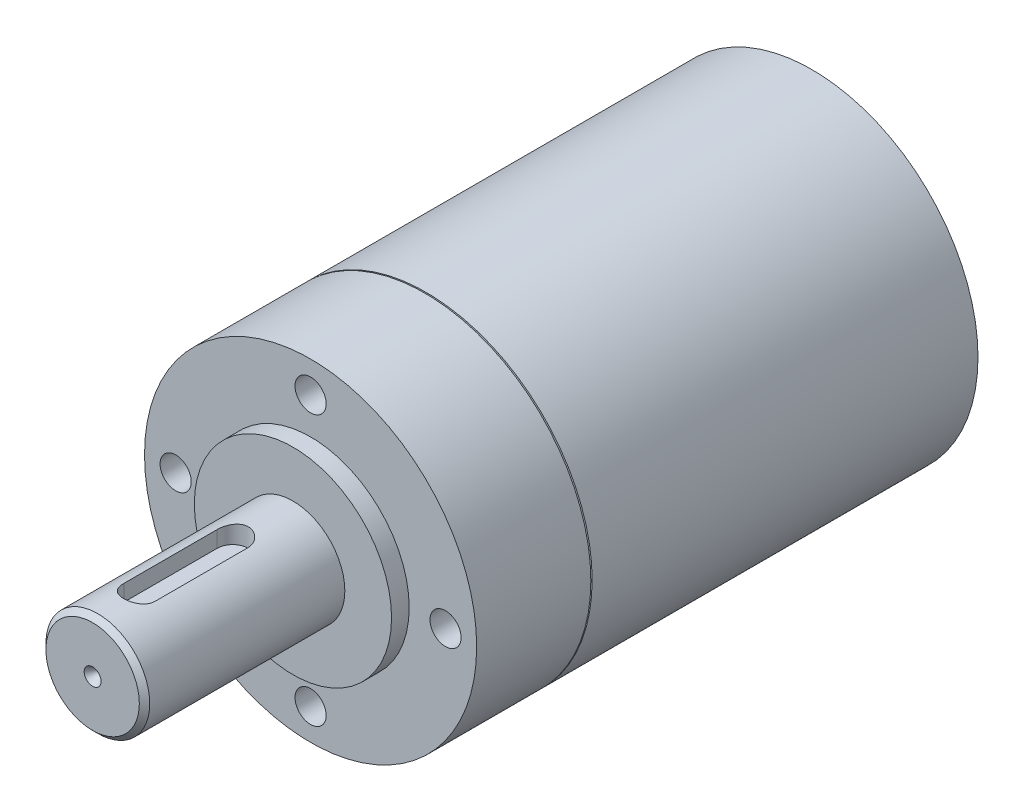
ISO-10303-21;
HEADER;
FILE_DESCRIPTION(('STEP AP214'),'2;1');
FILE_NAME('part.step','',(''),(''),'','','');
FILE_SCHEMA(('AUTOMOTIVE_DESIGN { 1 0 10303 214 1 1 1 1 }'));
ENDSEC;
DATA;
#1=APPLICATION_CONTEXT('core data for automotive mechanical design processes');
#2=APPLICATION_PROTOCOL_DEFINITION('international standard','automotive_design',2000,#1);
#3=PRODUCT_CONTEXT('',#1,'mechanical');
#4=PRODUCT('Part','Part','',(#3));
#5=PRODUCT_RELATED_PRODUCT_CATEGORY('part','',(#4));
#6=PRODUCT_DEFINITION_FORMATION('','',#4);
#7=PRODUCT_DEFINITION_CONTEXT('part definition',#1,'design');
#8=PRODUCT_DEFINITION('design','',#6,#7);
#9=PRODUCT_DEFINITION_SHAPE('','',#8);
#10=(LENGTH_UNIT() NAMED_UNIT(*) SI_UNIT(.MILLI.,.METRE.));
#11=(NAMED_UNIT(*) PLANE_ANGLE_UNIT() SI_UNIT($,.RADIAN.));
#12=(NAMED_UNIT(*) SI_UNIT($,.STERADIAN.) SOLID_ANGLE_UNIT());
#13=UNCERTAINTY_MEASURE_WITH_UNIT(LENGTH_MEASURE(1.E-05),#10,'distance_accuracy_value','');
#14=(GEOMETRIC_REPRESENTATION_CONTEXT(3) GLOBAL_UNCERTAINTY_ASSIGNED_CONTEXT((#13)) GLOBAL_UNIT_ASSIGNED_CONTEXT((#10,
#11,#12)) REPRESENTATION_CONTEXT('',''));
#15=CARTESIAN_POINT('',(0.,0.,0.));
#16=DIRECTION('',(0.,0.,1.));
#17=DIRECTION('',(1.,0.,0.));
#18=AXIS2_PLACEMENT_3D('',#15,#16,#17);
#19=CARTESIAN_POINT('',(0.,0.,69.3));
#20=DIRECTION('',(0.,0.,-1.));
#21=DIRECTION('',(-1.,0.,0.));
#22=AXIS2_PLACEMENT_3D('',#19,#20,#21);
#23=CYLINDRICAL_SURFACE('',#22,5.);
#24=CARTESIAN_POINT('',(0.,0.,68.8));
#25=DIRECTION('',(0.,0.,1.));
#26=DIRECTION('',(1.,0.,0.));
#27=AXIS2_PLACEMENT_3D('',#24,#25,#26);
#28=CIRCLE('',#27,5.);
#29=CARTESIAN_POINT('',(5.,0.,68.8));
#30=VERTEX_POINT('',#29);
#31=EDGE_CURVE('E11',#30,#30,#28,.F.);
#32=ORIENTED_EDGE('',*,*,#31,.T.);
#33=EDGE_LOOP('',(#32));
#34=FACE_BOUND('',#33,.T.);
#35=CARTESIAN_POINT('',(0.,0.,50.));
#36=DIRECTION('',(0.,0.,1.));
#37=DIRECTION('',(1.,0.,0.));
#38=AXIS2_PLACEMENT_3D('',#35,#36,#37);
#39=CIRCLE('',#38,5.);
#40=CARTESIAN_POINT('',(5.,0.,50.));
#41=VERTEX_POINT('',#40);
#42=EDGE_CURVE('E115',#41,#41,#39,.T.);
#43=ORIENTED_EDGE('',*,*,#42,.T.);
#44=EDGE_LOOP('',(#43));
#45=FACE_BOUND('',#44,.T.);
#46=CARTESIAN_POINT('',(-1.5,4.76969600708473,64.8));
#47=CARTESIAN_POINT('',(-1.50000085357071,4.76969249084934,64.841179392908));
#48=CARTESIAN_POINT('',(-1.49830317083428,4.77022997000129,64.8823380431261));
#49=CARTESIAN_POINT('',(-1.49153785660317,4.77235095109999,64.9643411620956));
#50=CARTESIAN_POINT('',(-1.48647098275841,4.77393421787376,65.0051856993949));
#51=CARTESIAN_POINT('',(-1.46630203689311,4.78018490618873,65.1265905409546));
#52=CARTESIAN_POINT('',(-1.44623120413663,4.78635370384275,65.2063063904164));
#53=CARTESIAN_POINT('',(-1.39353102315626,4.80195952113208,65.3610355783859));
#54=CARTESIAN_POINT('',(-1.36090607068203,4.81139539670393,65.4360505521981));
#55=CARTESIAN_POINT('',(-1.28407841117655,4.83246571212052,65.5795966815976));
#56=CARTESIAN_POINT('',(-1.23987031651226,4.84410117434933,65.6481247997284));
#57=CARTESIAN_POINT('',(-1.13964850658326,4.86866835244721,65.778866055997));
#58=CARTESIAN_POINT('',(-1.08333433465209,4.88162755412974,65.8408436603434));
#59=CARTESIAN_POINT('',(-0.961138919873356,4.90714811559049,65.9546355839));
#60=CARTESIAN_POINT('',(-0.895256063916351,4.91970940785249,66.0064481860031));
#61=CARTESIAN_POINT('',(-0.754109921315431,4.94333239727705,66.0994637703185));
#62=CARTESIAN_POINT('',(-0.678680819336257,4.95435770971354,66.1404251802979));
#63=CARTESIAN_POINT('',(-0.521621185505771,4.97334469846208,66.2089884116182));
#64=CARTESIAN_POINT('',(-0.439992259012928,4.98130716463903,66.2365936777943));
#65=CARTESIAN_POINT('',(-0.275324697874882,4.99307639935002,66.276879799102));
#66=CARTESIAN_POINT('',(-0.192393125294257,4.99699549276993,66.2899648579697));
#67=CARTESIAN_POINT('',(-0.025423571998086,5.00063202022426,66.3021173413633));
#68=CARTESIAN_POINT('',(0.058614196242357,5.00035024971471,66.3011874197001));
#69=CARTESIAN_POINT('',(0.222571599946011,4.99569602566267,66.285607091241));
#70=CARTESIAN_POINT('',(0.302537145464636,4.99145415509187,66.2713946550213));
#71=CARTESIAN_POINT('',(0.458890052102021,4.9795151369998,66.2303683647619));
#72=CARTESIAN_POINT('',(0.535277225531992,4.97181780846028,66.2035538505441));
#73=CARTESIAN_POINT('',(0.68334781589221,4.95365214926145,66.1377877783536));
#74=CARTESIAN_POINT('',(0.754966006044136,4.94315255692526,66.0986983556431));
#75=CARTESIAN_POINT('',(0.890765529574414,4.92049624651755,66.0096014099517));
#76=CARTESIAN_POINT('',(0.954945191614588,4.90833915735884,65.9595914405212));
#77=CARTESIAN_POINT('',(1.07665450541274,4.88311673571409,65.8478080119165));
#78=CARTESIAN_POINT('',(1.13383351478033,4.87003445449554,65.7856561362393));
#79=CARTESIAN_POINT('',(1.23706769492487,4.84484215114658,65.6525025765721));
#80=CARTESIAN_POINT('',(1.28311962013078,4.83273241337565,65.5814983196345));
#81=CARTESIAN_POINT('',(1.36316407240863,4.81077228795653,65.4317190715507));
#82=CARTESIAN_POINT('',(1.39703006341134,4.80094596245948,65.3528728204066));
#83=CARTESIAN_POINT('',(1.45085886004699,4.78495663653201,65.1902754960183));
#84=CARTESIAN_POINT('',(1.47084293218035,4.77878803475875,65.1065321392856));
#85=CARTESIAN_POINT('',(1.4890120359008,4.77314032325006,64.9850051109298));
#86=CARTESIAN_POINT('',(1.49313202989009,4.77185156275267,64.9481092658204));
#87=CARTESIAN_POINT('',(1.49862355614854,4.77012928611782,64.8741485209005));
#88=CARTESIAN_POINT('',(1.49999912968269,4.76969451246644,64.8370839503361));
#89=CARTESIAN_POINT('',(1.5,4.76969600708473,64.8));
#90=B_SPLINE_CURVE_WITH_KNOTS('',3,(#46,#47,#48,#49,#50,#51,#52,#53,#54,#55,#56,#57,#58,#59,#60,
#61,#62,#63,#64,#65,#66,#67,#68,#69,#70,#71,#72,#73,#74,#75,#76,#77,#78,#79,#80,#81,#82,#83,#84,
#85,#86,#87,#88,#89),.UNSPECIFIED.,.F.,.F.,(4,2,2,2,2,2,2,2,2,2,2,2,2,2,2,2,2,2,2,2,2,4),(0.,
0.123459071219737,0.246890388853026,0.492911349615204,0.73884624588433,0.984895736828089,
1.23795510798803,1.49105719006936,1.74939356197455,2.00766326783256,2.25854751319801,
2.5093842528947,2.75223130012966,2.99509107067835,3.2407824256273,3.48652887757004,
3.74172568310981,3.99699683536778,4.25484698071526,4.51230123440206,4.62365084745809,
4.73483637253615),.UNSPECIFIED.);
#91=CARTESIAN_POINT('',(-1.5,4.76969600708473,64.8));
#92=VERTEX_POINT('',#91);
#93=CARTESIAN_POINT('',(1.5,4.76969600708473,64.8));
#94=VERTEX_POINT('',#93);
#95=EDGE_CURVE('E82',#92,#94,#90,.T.);
#96=ORIENTED_EDGE('',*,*,#95,.F.);
#97=DIRECTION('',(0.,0.,-1.));
#98=VECTOR('',#97,1.);
#99=CARTESIAN_POINT('',(-1.5,4.76969600708473,69.3));
#100=LINE('',#99,#98);
#101=CARTESIAN_POINT('',(-1.5,4.76969600708473,55.8));
#102=VERTEX_POINT('',#101);
#103=EDGE_CURVE('E128',#102,#92,#100,.F.);
#104=ORIENTED_EDGE('',*,*,#103,.F.);
#105=CARTESIAN_POINT('',(1.5,4.76969600708473,55.8));
#106=CARTESIAN_POINT('',(1.50000085357071,4.76969249084934,55.758820607092));
#107=CARTESIAN_POINT('',(1.49830317083428,4.77022997000129,55.7176619568739));
#108=CARTESIAN_POINT('',(1.49153785660317,4.77235095109999,55.6356588379044));
#109=CARTESIAN_POINT('',(1.48647098275841,4.77393421787376,55.5948143006051));
#110=CARTESIAN_POINT('',(1.46630203689311,4.78018490618873,55.4734094590453));
#111=CARTESIAN_POINT('',(1.44623120413662,4.78635370384275,55.3936936095836));
#112=CARTESIAN_POINT('',(1.39353102315626,4.80195952113208,55.2389644216141));
#113=CARTESIAN_POINT('',(1.36090607068203,4.81139539670393,55.1639494478019));
#114=CARTESIAN_POINT('',(1.28407841117656,4.83246571212052,55.0204033184024));
#115=CARTESIAN_POINT('',(1.23987031651226,4.84410117434933,54.9518752002716));
#116=CARTESIAN_POINT('',(1.13964850658326,4.86866835244721,54.8211339440029));
#117=CARTESIAN_POINT('',(1.08333433465209,4.88162755412974,54.7591563396566));
#118=CARTESIAN_POINT('',(0.961138919873355,4.90714811559049,54.6453644161));
#119=CARTESIAN_POINT('',(0.895256063916348,4.91970940785249,54.5935518139969));
#120=CARTESIAN_POINT('',(0.754109921315429,4.94333239727705,54.5005362296815));
#121=CARTESIAN_POINT('',(0.678680819336258,4.95435770971354,54.459574819702));
#122=CARTESIAN_POINT('',(0.521621185505774,4.97334469846208,54.3910115883818));
#123=CARTESIAN_POINT('',(0.439992259012927,4.98130716463903,54.3634063222057));
#124=CARTESIAN_POINT('',(0.275324697874878,4.99307639935002,54.3231202008979));
#125=CARTESIAN_POINT('',(0.192393125294252,4.99699549276993,54.3100351420303));
#126=CARTESIAN_POINT('',(0.0254235719980798,5.00063202022426,54.2978826586367));
#127=CARTESIAN_POINT('',(-0.0586141962423645,5.00035024971471,54.2988125802998));
#128=CARTESIAN_POINT('',(-0.222571599946019,4.99569602566267,54.314392908759));
#129=CARTESIAN_POINT('',(-0.302537145464644,4.99145415509187,54.3286053449787));
#130=CARTESIAN_POINT('',(-0.458890052102028,4.9795151369998,54.3696316352381));
#131=CARTESIAN_POINT('',(-0.535277225531999,4.97181780846028,54.3964461494559));
#132=CARTESIAN_POINT('',(-0.683347815892216,4.95365214926145,54.4622122216464));
#133=CARTESIAN_POINT('',(-0.754966006044142,4.94315255692525,54.5013016443569));
#134=CARTESIAN_POINT('',(-0.89076552957442,4.92049624651755,54.5903985900483));
#135=CARTESIAN_POINT('',(-0.954945191614595,4.90833915735884,54.6404085594788));
#136=CARTESIAN_POINT('',(-1.07665450541275,4.88311673571409,54.7521919880835));
#137=CARTESIAN_POINT('',(-1.13383351478034,4.87003445449554,54.8143438637607));
#138=CARTESIAN_POINT('',(-1.23706769492487,4.84484215114658,54.9474974234279));
#139=CARTESIAN_POINT('',(-1.28311962013078,4.83273241337565,55.0185016803655));
#140=CARTESIAN_POINT('',(-1.36316407240864,4.81077228795653,55.1682809284493));
#141=CARTESIAN_POINT('',(-1.39703006341135,4.80094596245948,55.2471271795934));
#142=CARTESIAN_POINT('',(-1.45085886004699,4.78495663653201,55.4097245039817));
#143=CARTESIAN_POINT('',(-1.47084293218036,4.77878803475875,55.4934678607144));
#144=CARTESIAN_POINT('',(-1.4890120359008,4.77314032325006,55.6149948890702));
#145=CARTESIAN_POINT('',(-1.49313202989009,4.77185156275267,55.6518907341796));
#146=CARTESIAN_POINT('',(-1.49862355614854,4.77012928611782,55.7258514790995));
#147=CARTESIAN_POINT('',(-1.49999912968269,4.76969451246644,55.7629160496639));
#148=CARTESIAN_POINT('',(-1.5,4.76969600708473,55.8));
#149=B_SPLINE_CURVE_WITH_KNOTS('',3,(#105,#106,#107,#108,#109,#110,#111,#112,#113,#114,#115,
#116,#117,#118,#119,#120,#121,#122,#123,#124,#125,#126,#127,#128,#129,#130,#131,#132,#133,#134,
#135,#136,#137,#138,#139,#140,#141,#142,#143,#144,#145,#146,#147,#148),.UNSPECIFIED.,.F.,.F.,(4,
2,2,2,2,2,2,2,2,2,2,2,2,2,2,2,2,2,2,2,2,4),(0.,0.123459071219744,0.246890388853054,
0.492911349615212,0.738846245884322,0.984895736828089,1.23795510798802,1.49105719006936,
1.74939356197455,2.00766326783256,2.25854751319802,2.5093842528947,2.75223130012966,
2.99509107067836,3.2407824256273,3.48652887757005,3.74172568310981,3.99699683536778,
4.25484698071528,4.51230123440207,4.62365084745808,4.73483637253615),.UNSPECIFIED.);
#150=CARTESIAN_POINT('',(1.5,4.76969600708473,55.8));
#151=VERTEX_POINT('',#150);
#152=EDGE_CURVE('E132',#151,#102,#149,.T.);
#153=ORIENTED_EDGE('',*,*,#152,.F.);
#154=DIRECTION('',(0.,0.,-1.));
#155=VECTOR('',#154,1.);
#156=CARTESIAN_POINT('',(1.5,4.76969600708473,69.3));
#157=LINE('',#156,#155);
#158=EDGE_CURVE('E139',#94,#151,#157,.T.);
#159=ORIENTED_EDGE('',*,*,#158,.F.);
#160=EDGE_LOOP('',(#96,#104,#153,#159));
#161=FACE_BOUND('',#160,.T.);
#162=ADVANCED_FACE('F34',(#34,#45,#161),#23,.T.);
#163=CARTESIAN_POINT('',(0.,0.,50.));
#164=DIRECTION('',(0.,0.,1.));
#165=DIRECTION('',(1.,0.,0.));
#166=AXIS2_PLACEMENT_3D('',#163,#164,#165);
#167=PLANE('',#166);
#168=CARTESIAN_POINT('',(0.,0.,50.));
#169=DIRECTION('',(0.,0.,1.));
#170=DIRECTION('',(1.,0.,0.));
#171=AXIS2_PLACEMENT_3D('',#168,#169,#170);
#172=CIRCLE('',#171,9.5);
#173=CARTESIAN_POINT('',(9.5,0.,50.));
#174=VERTEX_POINT('',#173);
#175=EDGE_CURVE('E119',#174,#174,#172,.T.);
#176=ORIENTED_EDGE('',*,*,#175,.T.);
#177=EDGE_LOOP('',(#176));
#178=FACE_BOUND('',#177,.T.);
#179=ORIENTED_EDGE('',*,*,#42,.F.);
#180=EDGE_LOOP('',(#179));
#181=FACE_BOUND('',#180,.T.);
#182=ADVANCED_FACE('F191',(#178,#181),#167,.T.);
#183=CARTESIAN_POINT('',(0.,0.,48.3));
#184=DIRECTION('',(0.,0.,1.));
#185=DIRECTION('',(1.,0.,0.));
#186=AXIS2_PLACEMENT_3D('',#183,#184,#185);
#187=PLANE('',#186);
#188=CARTESIAN_POINT('',(13.,0.,48.3));
#189=DIRECTION('',(0.,0.,1.));
#190=DIRECTION('',(1.,0.,0.));
#191=AXIS2_PLACEMENT_3D('',#188,#189,#190);
#192=CIRCLE('',#191,1.5);
#193=CARTESIAN_POINT('',(14.5,0.,48.3));
#194=VERTEX_POINT('',#193);
#195=EDGE_CURVE('E356',#194,#194,#192,.T.);
#196=ORIENTED_EDGE('',*,*,#195,.F.);
#197=EDGE_LOOP('',(#196));
#198=FACE_BOUND('',#197,.T.);
#199=CARTESIAN_POINT('',(0.,-13.,48.3));
#200=DIRECTION('',(0.,0.,1.));
#201=DIRECTION('',(1.,0.,0.));
#202=AXIS2_PLACEMENT_3D('',#199,#200,#201);
#203=CIRCLE('',#202,1.5);
#204=CARTESIAN_POINT('',(1.5,-13.,48.3));
#205=VERTEX_POINT('',#204);
#206=EDGE_CURVE('E363',#205,#205,#203,.T.);
#207=ORIENTED_EDGE('',*,*,#206,.F.);
#208=EDGE_LOOP('',(#207));
#209=FACE_BOUND('',#208,.T.);
#210=CARTESIAN_POINT('',(-13.,0.,48.3));
#211=DIRECTION('',(0.,0.,1.));
#212=DIRECTION('',(1.,0.,0.));
#213=AXIS2_PLACEMENT_3D('',#210,#211,#212);
#214=CIRCLE('',#213,1.5);
#215=CARTESIAN_POINT('',(-11.5,0.,48.3));
#216=VERTEX_POINT('',#215);
#217=EDGE_CURVE('E369',#216,#216,#214,.T.);
#218=ORIENTED_EDGE('',*,*,#217,.F.);
#219=EDGE_LOOP('',(#218));
#220=FACE_BOUND('',#219,.T.);
#221=CARTESIAN_POINT('',(0.,13.,48.3));
#222=DIRECTION('',(0.,0.,1.));
#223=DIRECTION('',(1.,0.,0.));
#224=AXIS2_PLACEMENT_3D('',#221,#222,#223);
#225=CIRCLE('',#224,1.5);
#226=CARTESIAN_POINT('',(1.5,13.,48.3));
#227=VERTEX_POINT('',#226);
#228=EDGE_CURVE('E103',#227,#227,#225,.T.);
#229=ORIENTED_EDGE('',*,*,#228,.F.);
#230=EDGE_LOOP('',(#229));
#231=FACE_BOUND('',#230,.T.);
#232=CARTESIAN_POINT('',(0.,0.,48.3));
#233=DIRECTION('',(0.,0.,1.));
#234=DIRECTION('',(1.,0.,0.));
#235=AXIS2_PLACEMENT_3D('',#232,#233,#234);
#236=CIRCLE('',#235,16.);
#237=CARTESIAN_POINT('',(-16.,0.,48.3));
#238=VERTEX_POINT('',#237);
#239=EDGE_CURVE('E125',#238,#238,#236,.T.);
#240=ORIENTED_EDGE('',*,*,#239,.T.);
#241=EDGE_LOOP('',(#240));
#242=FACE_BOUND('',#241,.T.);
#243=CARTESIAN_POINT('',(0.,0.,48.3));
#244=DIRECTION('',(0.,0.,1.));
#245=DIRECTION('',(1.,0.,0.));
#246=AXIS2_PLACEMENT_3D('',#243,#244,#245);
#247=CIRCLE('',#246,9.5);
#248=CARTESIAN_POINT('',(9.5,0.,48.3));
#249=VERTEX_POINT('',#248);
#250=EDGE_CURVE('E118',#249,#249,#247,.T.);
#251=ORIENTED_EDGE('',*,*,#250,.F.);
#252=EDGE_LOOP('',(#251));
#253=FACE_BOUND('',#252,.T.);
#254=ADVANCED_FACE('F196',(#198,#209,#220,#231,#242,#253),#187,.T.);
#255=CARTESIAN_POINT('',(0.,0.,48.3));
#256=DIRECTION('',(0.,0.,-1.));
#257=DIRECTION('',(-1.,0.,0.));
#258=AXIS2_PLACEMENT_3D('',#255,#256,#257);
#259=CYLINDRICAL_SURFACE('',#258,16.);
#260=CARTESIAN_POINT('',(0.,0.,37.3));
#261=DIRECTION('',(0.,0.,1.));
#262=DIRECTION('',(1.,0.,0.));
#263=AXIS2_PLACEMENT_3D('',#260,#261,#262);
#264=CIRCLE('',#263,16.);
#265=CARTESIAN_POINT('',(-16.,0.,37.3));
#266=VERTEX_POINT('',#265);
#267=EDGE_CURVE('E167',#266,#266,#264,.T.);
#268=CARTESIAN_POINT('',(-16.,0.,37.3));
#269=CARTESIAN_POINT('',(-16.,0.,37.4145833333333));
#270=CARTESIAN_POINT('',(-16.,0.,37.5291666666667));
#271=CARTESIAN_POINT('',(-16.,0.,37.7583333333333));
#272=CARTESIAN_POINT('',(-16.,0.,37.8729166666667));
#273=CARTESIAN_POINT('',(-16.,0.,38.1020833333333));
#274=CARTESIAN_POINT('',(-16.,0.,38.2166666666667));
#275=CARTESIAN_POINT('',(-16.,0.,38.4458333333333));
#276=CARTESIAN_POINT('',(-16.,0.,38.5604166666667));
#277=CARTESIAN_POINT('',(-16.,0.,38.7895833333333));
#278=CARTESIAN_POINT('',(-16.,0.,38.9041666666667));
#279=CARTESIAN_POINT('',(-16.,0.,39.1333333333333));
#280=CARTESIAN_POINT('',(-16.,0.,39.2479166666667));
#281=CARTESIAN_POINT('',(-16.,0.,39.4770833333333));
#282=CARTESIAN_POINT('',(-16.,0.,39.5916666666667));
#283=CARTESIAN_POINT('',(-16.,0.,39.8208333333333));
#284=CARTESIAN_POINT('',(-16.,0.,39.9354166666667));
#285=CARTESIAN_POINT('',(-16.,0.,40.1645833333333));
#286=CARTESIAN_POINT('',(-16.,0.,40.2791666666667));
#287=CARTESIAN_POINT('',(-16.,0.,40.5083333333333));
#288=CARTESIAN_POINT('',(-16.,0.,40.6229166666667));
#289=CARTESIAN_POINT('',(-16.,0.,40.8520833333333));
#290=CARTESIAN_POINT('',(-16.,0.,40.9666666666667));
#291=CARTESIAN_POINT('',(-16.,0.,41.1958333333333));
#292=CARTESIAN_POINT('',(-16.,0.,41.3104166666667));
#293=CARTESIAN_POINT('',(-16.,0.,41.5395833333333));
#294=CARTESIAN_POINT('',(-16.,0.,41.6541666666667));
#295=CARTESIAN_POINT('',(-16.,0.,41.8833333333333));
#296=CARTESIAN_POINT('',(-16.,0.,41.9979166666667));
#297=CARTESIAN_POINT('',(-16.,0.,42.2270833333333));
#298=CARTESIAN_POINT('',(-16.,0.,42.3416666666667));
#299=CARTESIAN_POINT('',(-16.,0.,42.5708333333333));
#300=CARTESIAN_POINT('',(-16.,0.,42.6854166666667));
#301=CARTESIAN_POINT('',(-16.,0.,42.9145833333333));
#302=CARTESIAN_POINT('',(-16.,0.,43.0291666666667));
#303=CARTESIAN_POINT('',(-16.,0.,43.2583333333333));
#304=CARTESIAN_POINT('',(-16.,0.,43.3729166666667));
#305=CARTESIAN_POINT('',(-16.,0.,43.6020833333333));
#306=CARTESIAN_POINT('',(-16.,0.,43.7166666666667));
#307=CARTESIAN_POINT('',(-16.,0.,43.9458333333333));
#308=CARTESIAN_POINT('',(-16.,0.,44.0604166666667));
#309=CARTESIAN_POINT('',(-16.,0.,44.2895833333333));
#310=CARTESIAN_POINT('',(-16.,0.,44.4041666666667));
#311=CARTESIAN_POINT('',(-16.,0.,44.6333333333333));
#312=CARTESIAN_POINT('',(-16.,0.,44.7479166666667));
#313=CARTESIAN_POINT('',(-16.,0.,44.9770833333333));
#314=CARTESIAN_POINT('',(-16.,0.,45.0916666666667));
#315=CARTESIAN_POINT('',(-16.,0.,45.3208333333333));
#316=CARTESIAN_POINT('',(-16.,0.,45.4354166666667));
#317=CARTESIAN_POINT('',(-16.,0.,45.6645833333333));
#318=CARTESIAN_POINT('',(-16.,0.,45.7791666666667));
#319=CARTESIAN_POINT('',(-16.,0.,46.0083333333333));
#320=CARTESIAN_POINT('',(-16.,0.,46.1229166666667));
#321=CARTESIAN_POINT('',(-16.,0.,46.3520833333333));
#322=CARTESIAN_POINT('',(-16.,0.,46.4666666666667));
#323=CARTESIAN_POINT('',(-16.,0.,46.6958333333333));
#324=CARTESIAN_POINT('',(-16.,0.,46.8104166666667));
#325=CARTESIAN_POINT('',(-16.,0.,47.0395833333333));
#326=CARTESIAN_POINT('',(-16.,0.,47.1541666666667));
#327=CARTESIAN_POINT('',(-16.,0.,47.3833333333333));
#328=CARTESIAN_POINT('',(-16.,0.,47.4979166666667));
#329=CARTESIAN_POINT('',(-16.,0.,47.7270833333333));
#330=CARTESIAN_POINT('',(-16.,0.,47.8416666666667));
#331=CARTESIAN_POINT('',(-16.,0.,48.0708333333333));
#332=CARTESIAN_POINT('',(-16.,0.,48.1854166666667));
#333=CARTESIAN_POINT('',(-16.,0.,48.3));
#334=B_SPLINE_CURVE_WITH_KNOTS('',3,(#268,#269,#270,#271,#272,#273,#274,#275,#276,#277,#278,
#279,#280,#281,#282,#283,#284,#285,#286,#287,#288,#289,#290,#291,#292,#293,#294,#295,#296,#297,
#298,#299,#300,#301,#302,#303,#304,#305,#306,#307,#308,#309,#310,#311,#312,#313,#314,#315,#316,
#317,#318,#319,#320,#321,#322,#323,#324,#325,#326,#327,#328,#329,#330,#331,#332,#333),
.UNSPECIFIED.,.F.,.F.,(4,2,2,2,2,2,2,2,2,2,2,2,2,2,2,2,2,2,2,2,2,2,2,2,2,2,2,2,2,2,2,2,4),(0.,
0.343750000000004,0.687500000000001,1.03125,1.375,1.71875,2.0625,2.40625000000001,2.75,3.09375,
3.4375,3.78125,4.125,4.46875,4.8125,5.15625,5.5,5.84375,6.1875,6.53125,6.875,7.21875,7.5625,
7.90625,8.25,8.59375,8.9375,9.28125,9.625,9.96875,10.3125,10.65625,11.),.UNSPECIFIED.);
#335=EDGE_CURVE('BSEAM188',#266,#238,#334,.T.);
#336=ORIENTED_EDGE('',*,*,#267,.T.);
#337=ORIENTED_EDGE('',*,*,#239,.F.);
#338=ORIENTED_EDGE('',*,*,#335,.T.);
#339=ORIENTED_EDGE('',*,*,#335,.F.);
#340=EDGE_LOOP('',(#336,#338,#337,#339));
#341=FACE_BOUND('',#340,.T.);
#342=ADVANCED_FACE('F188',(#341),#259,.T.);
#343=CARTESIAN_POINT('',(0.,0.,50.));
#344=DIRECTION('',(0.,0.,-1.));
#345=DIRECTION('',(-1.,0.,0.));
#346=AXIS2_PLACEMENT_3D('',#343,#344,#345);
#347=CYLINDRICAL_SURFACE('',#346,9.5);
#348=ORIENTED_EDGE('',*,*,#175,.F.);
#349=EDGE_LOOP('',(#348));
#350=FACE_BOUND('',#349,.T.);
#351=ORIENTED_EDGE('',*,*,#250,.T.);
#352=EDGE_LOOP('',(#351));
#353=FACE_BOUND('',#352,.T.);
#354=ADVANCED_FACE('F311',(#350,#353),#347,.T.);
#355=CARTESIAN_POINT('',(0.,0.,69.3));
#356=DIRECTION('',(0.,0.,1.));
#357=DIRECTION('',(1.,0.,0.));
#358=AXIS2_PLACEMENT_3D('',#355,#356,#357);
#359=PLANE('',#358);
#360=CARTESIAN_POINT('',(0.,0.,69.3));
#361=DIRECTION('',(0.,0.,1.));
#362=DIRECTION('',(1.,0.,0.));
#363=AXIS2_PLACEMENT_3D('',#360,#361,#362);
#364=CIRCLE('',#363,4.50000000000002);
#365=CARTESIAN_POINT('',(4.50000000000002,0.,69.3));
#366=VERTEX_POINT('',#365);
#367=EDGE_CURVE('E42',#366,#366,#364,.T.);
#368=ORIENTED_EDGE('',*,*,#367,.T.);
#369=EDGE_LOOP('',(#368));
#370=FACE_BOUND('',#369,.T.);
#371=CARTESIAN_POINT('',(0.,0.,69.3));
#372=DIRECTION('',(0.,0.,1.));
#373=DIRECTION('',(1.,0.,0.));
#374=AXIS2_PLACEMENT_3D('',#371,#372,#373);
#375=CIRCLE('',#374,0.813334858543817);
#376=CARTESIAN_POINT('',(0.813334858543817,0.,69.3));
#377=VERTEX_POINT('',#376);
#378=EDGE_CURVE('E85',#377,#377,#375,.T.);
#379=ORIENTED_EDGE('',*,*,#378,.F.);
#380=EDGE_LOOP('',(#379));
#381=FACE_BOUND('',#380,.T.);
#382=ADVANCED_FACE('F177',(#370,#381),#359,.T.);
#383=CARTESIAN_POINT('',(0.,0.,69.3));
#384=DIRECTION('',(0.,0.,1.));
#385=DIRECTION('',(1.,0.,0.));
#386=AXIS2_PLACEMENT_3D('',#383,#384,#385);
#387=CONICAL_SURFACE('',#386,0.813334858543817,0.558505360638186);
#388=CARTESIAN_POINT('',(0.,0.,67.9983921421996));
#389=VERTEX_POINT('',#388);
#390=VERTEX_LOOP('',#389);
#391=FACE_BOUND('',#390,.T.);
#392=ORIENTED_EDGE('',*,*,#378,.T.);
#393=EDGE_LOOP('',(#392));
#394=FACE_BOUND('',#393,.T.);
#395=ADVANCED_FACE('F157',(#391,#394),#387,.F.);
#396=CARTESIAN_POINT('',(0.,6.2,64.8));
#397=DIRECTION('',(0.,-1.,0.));
#398=DIRECTION('',(0.,0.,-1.));
#399=AXIS2_PLACEMENT_3D('',#396,#397,#398);
#400=CYLINDRICAL_SURFACE('',#399,1.5);
#401=ORIENTED_EDGE('',*,*,#95,.T.);
#402=DIRECTION('',(0.,-1.,0.));
#403=VECTOR('',#402,1.);
#404=CARTESIAN_POINT('',(1.5,6.2,64.8));
#405=LINE('',#404,#403);
#406=CARTESIAN_POINT('',(1.5,3.2,64.8));
#407=VERTEX_POINT('',#406);
#408=EDGE_CURVE('E75',#94,#407,#405,.T.);
#409=ORIENTED_EDGE('',*,*,#408,.T.);
#410=CARTESIAN_POINT('',(0.,3.2,64.8));
#411=DIRECTION('',(0.,1.,0.));
#412=DIRECTION('',(0.,0.,1.));
#413=AXIS2_PLACEMENT_3D('',#410,#411,#412);
#414=CIRCLE('',#413,1.5);
#415=CARTESIAN_POINT('',(-1.5,3.2,64.8));
#416=VERTEX_POINT('',#415);
#417=EDGE_CURVE('E80',#416,#407,#414,.T.);
#418=ORIENTED_EDGE('',*,*,#417,.F.);
#419=DIRECTION('',(0.,-1.,0.));
#420=VECTOR('',#419,1.);
#421=CARTESIAN_POINT('',(-1.5,6.2,64.8));
#422=LINE('',#421,#420);
#423=EDGE_CURVE('E109',#92,#416,#422,.T.);
#424=ORIENTED_EDGE('',*,*,#423,.F.);
#425=EDGE_LOOP('',(#401,#409,#418,#424));
#426=FACE_BOUND('',#425,.T.);
#427=ADVANCED_FACE('F77',(#426),#400,.F.);
#428=CARTESIAN_POINT('',(1.5,6.2,64.8));
#429=DIRECTION('',(-1.,0.,0.));
#430=DIRECTION('',(0.,0.,1.));
#431=AXIS2_PLACEMENT_3D('',#428,#429,#430);
#432=PLANE('',#431);
#433=ORIENTED_EDGE('',*,*,#158,.T.);
#434=DIRECTION('',(0.,-1.,0.));
#435=VECTOR('',#434,1.);
#436=CARTESIAN_POINT('',(1.5,6.2,55.8));
#437=LINE('',#436,#435);
#438=CARTESIAN_POINT('',(1.5,3.2,55.8));
#439=VERTEX_POINT('',#438);
#440=EDGE_CURVE('E86',#151,#439,#437,.T.);
#441=ORIENTED_EDGE('',*,*,#440,.T.);
#442=DIRECTION('',(0.,0.,-1.));
#443=VECTOR('',#442,1.);
#444=CARTESIAN_POINT('',(1.5,3.2,64.8));
#445=LINE('',#444,#443);
#446=EDGE_CURVE('E89',#407,#439,#445,.T.);
#447=ORIENTED_EDGE('',*,*,#446,.F.);
#448=ORIENTED_EDGE('',*,*,#408,.F.);
#449=EDGE_LOOP('',(#433,#441,#447,#448));
#450=FACE_BOUND('',#449,.T.);
#451=ADVANCED_FACE('F90',(#450),#432,.T.);
#452=CARTESIAN_POINT('',(0.,6.2,55.8));
#453=DIRECTION('',(0.,-1.,0.));
#454=DIRECTION('',(0.,0.,-1.));
#455=AXIS2_PLACEMENT_3D('',#452,#453,#454);
#456=CYLINDRICAL_SURFACE('',#455,1.5);
#457=ORIENTED_EDGE('',*,*,#152,.T.);
#458=DIRECTION('',(0.,-1.,0.));
#459=VECTOR('',#458,1.);
#460=CARTESIAN_POINT('',(-1.5,6.2,55.8));
#461=LINE('',#460,#459);
#462=CARTESIAN_POINT('',(-1.5,3.2,55.8));
#463=VERTEX_POINT('',#462);
#464=EDGE_CURVE('E49',#102,#463,#461,.T.);
#465=ORIENTED_EDGE('',*,*,#464,.T.);
#466=CARTESIAN_POINT('',(0.,3.2,55.8));
#467=DIRECTION('',(0.,1.,0.));
#468=DIRECTION('',(0.,0.,1.));
#469=AXIS2_PLACEMENT_3D('',#466,#467,#468);
#470=CIRCLE('',#469,1.5);
#471=EDGE_CURVE('E95',#439,#463,#470,.T.);
#472=ORIENTED_EDGE('',*,*,#471,.F.);
#473=ORIENTED_EDGE('',*,*,#440,.F.);
#474=EDGE_LOOP('',(#457,#465,#472,#473));
#475=FACE_BOUND('',#474,.T.);
#476=ADVANCED_FACE('F144',(#475),#456,.F.);
#477=CARTESIAN_POINT('',(-1.5,6.2,64.8));
#478=DIRECTION('',(1.,0.,0.));
#479=DIRECTION('',(0.,0.,-1.));
#480=AXIS2_PLACEMENT_3D('',#477,#478,#479);
#481=PLANE('',#480);
#482=ORIENTED_EDGE('',*,*,#103,.T.);
#483=ORIENTED_EDGE('',*,*,#423,.T.);
#484=DIRECTION('',(0.,0.,1.));
#485=VECTOR('',#484,1.);
#486=CARTESIAN_POINT('',(-1.5,3.2,64.8));
#487=LINE('',#486,#485);
#488=EDGE_CURVE('E99',#463,#416,#487,.T.);
#489=ORIENTED_EDGE('',*,*,#488,.F.);
#490=ORIENTED_EDGE('',*,*,#464,.F.);
#491=EDGE_LOOP('',(#482,#483,#489,#490));
#492=FACE_BOUND('',#491,.T.);
#493=ADVANCED_FACE('F149',(#492),#481,.T.);
#494=CARTESIAN_POINT('',(0.,3.2,64.8));
#495=DIRECTION('',(0.,1.,0.));
#496=DIRECTION('',(0.,0.,1.));
#497=AXIS2_PLACEMENT_3D('',#494,#495,#496);
#498=PLANE('',#497);
#499=ORIENTED_EDGE('',*,*,#417,.T.);
#500=ORIENTED_EDGE('',*,*,#446,.T.);
#501=ORIENTED_EDGE('',*,*,#471,.T.);
#502=ORIENTED_EDGE('',*,*,#488,.T.);
#503=EDGE_LOOP('',(#499,#500,#501,#502));
#504=FACE_BOUND('',#503,.T.);
#505=ADVANCED_FACE('F98',(#504),#498,.T.);
#506=CARTESIAN_POINT('',(0.,13.,42.3));
#507=DIRECTION('',(0.,0.,1.));
#508=DIRECTION('',(1.,0.,0.));
#509=AXIS2_PLACEMENT_3D('',#506,#507,#508);
#510=CYLINDRICAL_SURFACE('',#509,1.5);
#511=CARTESIAN_POINT('',(0.,13.,42.3));
#512=DIRECTION('',(0.,0.,1.));
#513=DIRECTION('',(1.,0.,0.));
#514=AXIS2_PLACEMENT_3D('',#511,#512,#513);
#515=CIRCLE('',#514,1.5);
#516=CARTESIAN_POINT('',(1.5,13.,42.3));
#517=VERTEX_POINT('',#516);
#518=EDGE_CURVE('E100',#517,#517,#515,.T.);
#519=ORIENTED_EDGE('',*,*,#518,.F.);
#520=EDGE_LOOP('',(#519));
#521=FACE_BOUND('',#520,.T.);
#522=ORIENTED_EDGE('',*,*,#228,.T.);
#523=EDGE_LOOP('',(#522));
#524=FACE_BOUND('',#523,.T.);
#525=ADVANCED_FACE('F207',(#521,#524),#510,.F.);
#526=CARTESIAN_POINT('',(0.,13.,42.3));
#527=DIRECTION('',(0.,0.,1.));
#528=DIRECTION('',(1.,0.,0.));
#529=AXIS2_PLACEMENT_3D('',#526,#527,#528);
#530=PLANE('',#529);
#531=ORIENTED_EDGE('',*,*,#518,.T.);
#532=EDGE_LOOP('',(#531));
#533=FACE_BOUND('',#532,.T.);
#534=ADVANCED_FACE('F211',(#533),#530,.T.);
#535=CARTESIAN_POINT('',(-13.,0.,42.3));
#536=DIRECTION('',(0.,0.,1.));
#537=DIRECTION('',(1.,0.,0.));
#538=AXIS2_PLACEMENT_3D('',#535,#536,#537);
#539=CYLINDRICAL_SURFACE('',#538,1.5);
#540=CARTESIAN_POINT('',(-13.,0.,42.3));
#541=DIRECTION('',(0.,0.,1.));
#542=DIRECTION('',(1.,0.,0.));
#543=AXIS2_PLACEMENT_3D('',#540,#541,#542);
#544=CIRCLE('',#543,1.5);
#545=CARTESIAN_POINT('',(-11.5,0.,42.3));
#546=VERTEX_POINT('',#545);
#547=EDGE_CURVE('E372',#546,#546,#544,.T.);
#548=ORIENTED_EDGE('',*,*,#547,.F.);
#549=EDGE_LOOP('',(#548));
#550=FACE_BOUND('',#549,.T.);
#551=ORIENTED_EDGE('',*,*,#217,.T.);
#552=EDGE_LOOP('',(#551));
#553=FACE_BOUND('',#552,.T.);
#554=ADVANCED_FACE('F217',(#550,#553),#539,.F.);
#555=CARTESIAN_POINT('',(-13.,0.,42.3));
#556=DIRECTION('',(0.,0.,1.));
#557=DIRECTION('',(1.,0.,0.));
#558=AXIS2_PLACEMENT_3D('',#555,#556,#557);
#559=PLANE('',#558);
#560=ORIENTED_EDGE('',*,*,#547,.T.);
#561=EDGE_LOOP('',(#560));
#562=FACE_BOUND('',#561,.T.);
#563=ADVANCED_FACE('F221',(#562),#559,.T.);
#564=CARTESIAN_POINT('',(0.,-13.,42.3));
#565=DIRECTION('',(0.,0.,1.));
#566=DIRECTION('',(1.,0.,0.));
#567=AXIS2_PLACEMENT_3D('',#564,#565,#566);
#568=CYLINDRICAL_SURFACE('',#567,1.5);
#569=CARTESIAN_POINT('',(0.,-13.,42.3));
#570=DIRECTION('',(0.,0.,1.));
#571=DIRECTION('',(1.,0.,0.));
#572=AXIS2_PLACEMENT_3D('',#569,#570,#571);
#573=CIRCLE('',#572,1.5);
#574=CARTESIAN_POINT('',(1.5,-13.,42.3));
#575=VERTEX_POINT('',#574);
#576=EDGE_CURVE('E366',#575,#575,#573,.T.);
#577=ORIENTED_EDGE('',*,*,#576,.F.);
#578=EDGE_LOOP('',(#577));
#579=FACE_BOUND('',#578,.T.);
#580=ORIENTED_EDGE('',*,*,#206,.T.);
#581=EDGE_LOOP('',(#580));
#582=FACE_BOUND('',#581,.T.);
#583=ADVANCED_FACE('F225',(#579,#582),#568,.F.);
#584=CARTESIAN_POINT('',(0.,-13.,42.3));
#585=DIRECTION('',(0.,0.,1.));
#586=DIRECTION('',(1.,0.,0.));
#587=AXIS2_PLACEMENT_3D('',#584,#585,#586);
#588=PLANE('',#587);
#589=ORIENTED_EDGE('',*,*,#576,.T.);
#590=EDGE_LOOP('',(#589));
#591=FACE_BOUND('',#590,.T.);
#592=ADVANCED_FACE('F229',(#591),#588,.T.);
#593=CARTESIAN_POINT('',(13.,0.,42.3));
#594=DIRECTION('',(0.,0.,1.));
#595=DIRECTION('',(1.,0.,0.));
#596=AXIS2_PLACEMENT_3D('',#593,#594,#595);
#597=CYLINDRICAL_SURFACE('',#596,1.5);
#598=CARTESIAN_POINT('',(13.,0.,42.3));
#599=DIRECTION('',(0.,0.,1.));
#600=DIRECTION('',(1.,0.,0.));
#601=AXIS2_PLACEMENT_3D('',#598,#599,#600);
#602=CIRCLE('',#601,1.5);
#603=CARTESIAN_POINT('',(14.5,0.,42.3));
#604=VERTEX_POINT('',#603);
#605=EDGE_CURVE('E360',#604,#604,#602,.T.);
#606=ORIENTED_EDGE('',*,*,#605,.F.);
#607=EDGE_LOOP('',(#606));
#608=FACE_BOUND('',#607,.T.);
#609=ORIENTED_EDGE('',*,*,#195,.T.);
#610=EDGE_LOOP('',(#609));
#611=FACE_BOUND('',#610,.T.);
#612=ADVANCED_FACE('F233',(#608,#611),#597,.F.);
#613=CARTESIAN_POINT('',(13.,0.,42.3));
#614=DIRECTION('',(0.,0.,1.));
#615=DIRECTION('',(1.,0.,0.));
#616=AXIS2_PLACEMENT_3D('',#613,#614,#615);
#617=PLANE('',#616);
#618=ORIENTED_EDGE('',*,*,#605,.T.);
#619=EDGE_LOOP('',(#618));
#620=FACE_BOUND('',#619,.T.);
#621=ADVANCED_FACE('F237',(#620),#617,.T.);
#622=CARTESIAN_POINT('',(17.2076273766556,0.,37.1732216353128));
#623=DIRECTION('',(0.,0.,-1.));
#624=DIRECTION('',(-1.,0.,0.));
#625=AXIS2_PLACEMENT_3D('',#622,#623,#624);
#626=PLANE('',#625);
#627=CARTESIAN_POINT('',(0.,0.,37.1732216353128));
#628=DIRECTION('',(0.,0.,1.));
#629=DIRECTION('',(1.,0.,0.));
#630=AXIS2_PLACEMENT_3D('',#627,#628,#629);
#631=CIRCLE('',#630,15.8202354558935);
#632=CARTESIAN_POINT('',(15.8202354558935,0.,37.1732216353128));
#633=VERTEX_POINT('',#632);
#634=EDGE_CURVE('E171',#633,#633,#631,.T.);
#635=ORIENTED_EDGE('',*,*,#634,.F.);
#636=EDGE_LOOP('',(#635));
#637=FACE_BOUND('',#636,.T.);
#638=CARTESIAN_POINT('',(0.,0.,37.1732216353128));
#639=DIRECTION('',(0.,0.,-1.));
#640=DIRECTION('',(-1.,0.,0.));
#641=AXIS2_PLACEMENT_3D('',#638,#639,#640);
#642=CIRCLE('',#641,16.);
#643=CARTESIAN_POINT('',(-16.,0.,37.1732216353128));
#644=VERTEX_POINT('',#643);
#645=EDGE_CURVE('E170',#644,#644,#642,.T.);
#646=ORIENTED_EDGE('',*,*,#645,.F.);
#647=EDGE_LOOP('',(#646));
#648=FACE_BOUND('',#647,.T.);
#649=ADVANCED_FACE('F241',(#637,#648),#626,.F.);
#650=CARTESIAN_POINT('',(17.2076273766556,0.,37.3));
#651=DIRECTION('',(0.,0.,1.));
#652=DIRECTION('',(1.,0.,0.));
#653=AXIS2_PLACEMENT_3D('',#650,#651,#652);
#654=PLANE('',#653);
#655=CARTESIAN_POINT('',(0.,0.,37.3));
#656=DIRECTION('',(0.,0.,1.));
#657=DIRECTION('',(1.,0.,0.));
#658=AXIS2_PLACEMENT_3D('',#655,#656,#657);
#659=CIRCLE('',#658,15.8202354558935);
#660=CARTESIAN_POINT('',(15.8202354558935,0.,37.3));
#661=VERTEX_POINT('',#660);
#662=EDGE_CURVE('E306',#661,#661,#659,.T.);
#663=ORIENTED_EDGE('',*,*,#662,.T.);
#664=EDGE_LOOP('',(#663));
#665=FACE_BOUND('',#664,.T.);
#666=ORIENTED_EDGE('',*,*,#267,.F.);
#667=EDGE_LOOP('',(#666));
#668=FACE_BOUND('',#667,.T.);
#669=ADVANCED_FACE('F294',(#665,#668),#654,.F.);
#670=CARTESIAN_POINT('',(0.,0.,69.3));
#671=DIRECTION('',(0.,0.,1.));
#672=DIRECTION('',(1.,0.,0.));
#673=AXIS2_PLACEMENT_3D('',#670,#671,#672);
#674=CYLINDRICAL_SURFACE('',#673,15.8202354558935);
#675=ORIENTED_EDGE('',*,*,#662,.F.);
#676=EDGE_LOOP('',(#675));
#677=FACE_BOUND('',#676,.T.);
#678=ORIENTED_EDGE('',*,*,#634,.T.);
#679=EDGE_LOOP('',(#678));
#680=FACE_BOUND('',#679,.T.);
#681=ADVANCED_FACE('F261',(#677,#680),#674,.T.);
#682=CARTESIAN_POINT('',(0.,0.,20.));
#683=DIRECTION('',(0.,0.,-1.));
#684=DIRECTION('',(-1.,0.,0.));
#685=AXIS2_PLACEMENT_3D('',#682,#683,#684);
#686=PLANE('',#685);
#687=CARTESIAN_POINT('',(0.,0.,20.));
#688=DIRECTION('',(0.,0.,-1.));
#689=DIRECTION('',(-1.,0.,0.));
#690=AXIS2_PLACEMENT_3D('',#687,#688,#689);
#691=CIRCLE('',#690,2.5);
#692=CARTESIAN_POINT('',(-2.5,0.,20.));
#693=VERTEX_POINT('',#692);
#694=EDGE_CURVE('E166',#693,#693,#691,.T.);
#695=ORIENTED_EDGE('',*,*,#694,.T.);
#696=EDGE_LOOP('',(#695));
#697=FACE_BOUND('',#696,.T.);
#698=ADVANCED_FACE('F257',(#697),#686,.T.);
#699=CARTESIAN_POINT('',(0.,0.,20.));
#700=DIRECTION('',(0.,0.,-1.));
#701=DIRECTION('',(-1.,0.,0.));
#702=AXIS2_PLACEMENT_3D('',#699,#700,#701);
#703=CYLINDRICAL_SURFACE('',#702,2.5);
#704=CARTESIAN_POINT('',(0.,0.,1.2));
#705=DIRECTION('',(0.,0.,-1.));
#706=DIRECTION('',(-1.,0.,0.));
#707=AXIS2_PLACEMENT_3D('',#704,#705,#706);
#708=CIRCLE('',#707,2.5);
#709=CARTESIAN_POINT('',(-2.5,0.,1.2));
#710=VERTEX_POINT('',#709);
#711=EDGE_CURVE('E162',#710,#710,#708,.T.);
#712=ORIENTED_EDGE('',*,*,#711,.T.);
#713=EDGE_LOOP('',(#712));
#714=FACE_BOUND('',#713,.T.);
#715=ORIENTED_EDGE('',*,*,#694,.F.);
#716=EDGE_LOOP('',(#715));
#717=FACE_BOUND('',#716,.T.);
#718=ADVANCED_FACE('F253',(#714,#717),#703,.F.);
#719=CARTESIAN_POINT('',(0.,0.,1.2));
#720=DIRECTION('',(0.,0.,-1.));
#721=DIRECTION('',(-1.,0.,0.));
#722=AXIS2_PLACEMENT_3D('',#719,#720,#721);
#723=PLANE('',#722);
#724=ORIENTED_EDGE('',*,*,#711,.F.);
#725=EDGE_LOOP('',(#724));
#726=FACE_BOUND('',#725,.T.);
#727=CARTESIAN_POINT('',(0.,0.,1.2));
#728=DIRECTION('',(0.,0.,-1.));
#729=DIRECTION('',(-1.,0.,0.));
#730=AXIS2_PLACEMENT_3D('',#727,#728,#729);
#731=CIRCLE('',#730,8.);
#732=CARTESIAN_POINT('',(-8.,0.,1.2));
#733=VERTEX_POINT('',#732);
#734=EDGE_CURVE('E353',#733,#733,#731,.T.);
#735=ORIENTED_EDGE('',*,*,#734,.T.);
#736=EDGE_LOOP('',(#735));
#737=FACE_BOUND('',#736,.T.);
#738=ADVANCED_FACE('F249',(#726,#737),#723,.T.);
#739=CARTESIAN_POINT('',(0.,11.,4.));
#740=DIRECTION('',(0.,0.,-1.));
#741=DIRECTION('',(-1.,0.,0.));
#742=AXIS2_PLACEMENT_3D('',#739,#740,#741);
#743=PLANE('',#742);
#744=CARTESIAN_POINT('',(0.,11.,4.));
#745=DIRECTION('',(0.,0.,-1.));
#746=DIRECTION('',(-1.,0.,0.));
#747=AXIS2_PLACEMENT_3D('',#744,#745,#746);
#748=CIRCLE('',#747,1.5);
#749=CARTESIAN_POINT('',(-1.5,11.,4.));
#750=VERTEX_POINT('',#749);
#751=EDGE_CURVE('E393',#750,#750,#748,.T.);
#752=ORIENTED_EDGE('',*,*,#751,.T.);
#753=EDGE_LOOP('',(#752));
#754=FACE_BOUND('',#753,.T.);
#755=ADVANCED_FACE('F252',(#754),#743,.T.);
#756=CARTESIAN_POINT('',(-11.,0.,4.));
#757=DIRECTION('',(0.,0.,-1.));
#758=DIRECTION('',(-1.,0.,0.));
#759=AXIS2_PLACEMENT_3D('',#756,#757,#758);
#760=PLANE('',#759);
#761=CARTESIAN_POINT('',(-11.,0.,4.));
#762=DIRECTION('',(0.,0.,-1.));
#763=DIRECTION('',(-1.,0.,0.));
#764=AXIS2_PLACEMENT_3D('',#761,#762,#763);
#765=CIRCLE('',#764,1.5);
#766=CARTESIAN_POINT('',(-12.5,0.,4.));
#767=VERTEX_POINT('',#766);
#768=EDGE_CURVE('E395',#767,#767,#765,.T.);
#769=ORIENTED_EDGE('',*,*,#768,.T.);
#770=EDGE_LOOP('',(#769));
#771=FACE_BOUND('',#770,.T.);
#772=ADVANCED_FACE('F269',(#771),#760,.T.);
#773=CARTESIAN_POINT('',(0.,-11.,4.));
#774=DIRECTION('',(0.,0.,-1.));
#775=DIRECTION('',(-1.,0.,0.));
#776=AXIS2_PLACEMENT_3D('',#773,#774,#775);
#777=PLANE('',#776);
#778=CARTESIAN_POINT('',(0.,-11.,4.));
#779=DIRECTION('',(0.,0.,-1.));
#780=DIRECTION('',(-1.,0.,0.));
#781=AXIS2_PLACEMENT_3D('',#778,#779,#780);
#782=CIRCLE('',#781,1.5);
#783=CARTESIAN_POINT('',(-1.5,-11.,4.));
#784=VERTEX_POINT('',#783);
#785=EDGE_CURVE('E399',#784,#784,#782,.T.);
#786=ORIENTED_EDGE('',*,*,#785,.T.);
#787=EDGE_LOOP('',(#786));
#788=FACE_BOUND('',#787,.T.);
#789=ADVANCED_FACE('F277',(#788),#777,.T.);
#790=CARTESIAN_POINT('',(11.,0.,4.));
#791=DIRECTION('',(0.,0.,-1.));
#792=DIRECTION('',(-1.,0.,0.));
#793=AXIS2_PLACEMENT_3D('',#790,#791,#792);
#794=PLANE('',#793);
#795=CARTESIAN_POINT('',(11.,0.,4.));
#796=DIRECTION('',(0.,0.,-1.));
#797=DIRECTION('',(-1.,0.,0.));
#798=AXIS2_PLACEMENT_3D('',#795,#796,#797);
#799=CIRCLE('',#798,1.5);
#800=CARTESIAN_POINT('',(9.5,0.,4.));
#801=VERTEX_POINT('',#800);
#802=EDGE_CURVE('E403',#801,#801,#799,.T.);
#803=ORIENTED_EDGE('',*,*,#802,.T.);
#804=EDGE_LOOP('',(#803));
#805=FACE_BOUND('',#804,.T.);
#806=ADVANCED_FACE('F247',(#805),#794,.T.);
#807=CARTESIAN_POINT('',(0.,0.,1.2));
#808=DIRECTION('',(0.,0.,-1.));
#809=DIRECTION('',(-1.,0.,0.));
#810=AXIS2_PLACEMENT_3D('',#807,#808,#809);
#811=CYLINDRICAL_SURFACE('',#810,8.);
#812=ORIENTED_EDGE('',*,*,#734,.F.);
#813=EDGE_LOOP('',(#812));
#814=FACE_BOUND('',#813,.T.);
#815=CARTESIAN_POINT('',(0.,0.,0.));
#816=DIRECTION('',(0.,0.,-1.));
#817=DIRECTION('',(-1.,0.,0.));
#818=AXIS2_PLACEMENT_3D('',#815,#816,#817);
#819=CIRCLE('',#818,8.);
#820=CARTESIAN_POINT('',(-8.,0.,0.));
#821=VERTEX_POINT('',#820);
#822=EDGE_CURVE('E165',#821,#821,#819,.T.);
#823=ORIENTED_EDGE('',*,*,#822,.T.);
#824=EDGE_LOOP('',(#823));
#825=FACE_BOUND('',#824,.T.);
#826=ADVANCED_FACE('F243',(#814,#825),#811,.F.);
#827=CARTESIAN_POINT('',(0.,11.,4.));
#828=DIRECTION('',(0.,0.,-1.));
#829=DIRECTION('',(-1.,0.,0.));
#830=AXIS2_PLACEMENT_3D('',#827,#828,#829);
#831=CYLINDRICAL_SURFACE('',#830,1.5);
#832=ORIENTED_EDGE('',*,*,#751,.F.);
#833=EDGE_LOOP('',(#832));
#834=FACE_BOUND('',#833,.T.);
#835=CARTESIAN_POINT('',(0.,11.,0.));
#836=DIRECTION('',(0.,0.,-1.));
#837=DIRECTION('',(-1.,0.,0.));
#838=AXIS2_PLACEMENT_3D('',#835,#836,#837);
#839=CIRCLE('',#838,1.5);
#840=CARTESIAN_POINT('',(-1.5,11.,0.));
#841=VERTEX_POINT('',#840);
#842=EDGE_CURVE('E346',#841,#841,#839,.T.);
#843=ORIENTED_EDGE('',*,*,#842,.T.);
#844=EDGE_LOOP('',(#843));
#845=FACE_BOUND('',#844,.T.);
#846=ADVANCED_FACE('F246',(#834,#845),#831,.F.);
#847=CARTESIAN_POINT('',(-11.,0.,4.));
#848=DIRECTION('',(0.,0.,-1.));
#849=DIRECTION('',(-1.,0.,0.));
#850=AXIS2_PLACEMENT_3D('',#847,#848,#849);
#851=CYLINDRICAL_SURFACE('',#850,1.5);
#852=ORIENTED_EDGE('',*,*,#768,.F.);
#853=EDGE_LOOP('',(#852));
#854=FACE_BOUND('',#853,.T.);
#855=CARTESIAN_POINT('',(-11.,0.,0.));
#856=DIRECTION('',(0.,0.,-1.));
#857=DIRECTION('',(-1.,0.,0.));
#858=AXIS2_PLACEMENT_3D('',#855,#856,#857);
#859=CIRCLE('',#858,1.5);
#860=CARTESIAN_POINT('',(-12.5,0.,0.));
#861=VERTEX_POINT('',#860);
#862=EDGE_CURVE('E342',#861,#861,#859,.T.);
#863=ORIENTED_EDGE('',*,*,#862,.T.);
#864=EDGE_LOOP('',(#863));
#865=FACE_BOUND('',#864,.T.);
#866=ADVANCED_FACE('F265',(#854,#865),#851,.F.);
#867=CARTESIAN_POINT('',(0.,-11.,4.));
#868=DIRECTION('',(0.,0.,-1.));
#869=DIRECTION('',(-1.,0.,0.));
#870=AXIS2_PLACEMENT_3D('',#867,#868,#869);
#871=CYLINDRICAL_SURFACE('',#870,1.5);
#872=ORIENTED_EDGE('',*,*,#785,.F.);
#873=EDGE_LOOP('',(#872));
#874=FACE_BOUND('',#873,.T.);
#875=CARTESIAN_POINT('',(0.,-11.,0.));
#876=DIRECTION('',(0.,0.,-1.));
#877=DIRECTION('',(-1.,0.,0.));
#878=AXIS2_PLACEMENT_3D('',#875,#876,#877);
#879=CIRCLE('',#878,1.5);
#880=CARTESIAN_POINT('',(-1.5,-11.,0.));
#881=VERTEX_POINT('',#880);
#882=EDGE_CURVE('E338',#881,#881,#879,.T.);
#883=ORIENTED_EDGE('',*,*,#882,.T.);
#884=EDGE_LOOP('',(#883));
#885=FACE_BOUND('',#884,.T.);
#886=ADVANCED_FACE('F273',(#874,#885),#871,.F.);
#887=CARTESIAN_POINT('',(11.,0.,4.));
#888=DIRECTION('',(0.,0.,-1.));
#889=DIRECTION('',(-1.,0.,0.));
#890=AXIS2_PLACEMENT_3D('',#887,#888,#889);
#891=CYLINDRICAL_SURFACE('',#890,1.5);
#892=ORIENTED_EDGE('',*,*,#802,.F.);
#893=EDGE_LOOP('',(#892));
#894=FACE_BOUND('',#893,.T.);
#895=CARTESIAN_POINT('',(11.,0.,0.));
#896=DIRECTION('',(0.,0.,-1.));
#897=DIRECTION('',(-1.,0.,0.));
#898=AXIS2_PLACEMENT_3D('',#895,#896,#897);
#899=CIRCLE('',#898,1.5);
#900=CARTESIAN_POINT('',(9.5,0.,0.));
#901=VERTEX_POINT('',#900);
#902=EDGE_CURVE('E173',#901,#901,#899,.T.);
#903=ORIENTED_EDGE('',*,*,#902,.T.);
#904=EDGE_LOOP('',(#903));
#905=FACE_BOUND('',#904,.T.);
#906=ADVANCED_FACE('F281',(#894,#905),#891,.F.);
#907=CARTESIAN_POINT('',(0.,0.,0.));
#908=DIRECTION('',(0.,0.,1.));
#909=DIRECTION('',(1.,0.,0.));
#910=AXIS2_PLACEMENT_3D('',#907,#908,#909);
#911=PLANE('',#910);
#912=ORIENTED_EDGE('',*,*,#902,.F.);
#913=EDGE_LOOP('',(#912));
#914=FACE_BOUND('',#913,.T.);
#915=ORIENTED_EDGE('',*,*,#882,.F.);
#916=EDGE_LOOP('',(#915));
#917=FACE_BOUND('',#916,.T.);
#918=ORIENTED_EDGE('',*,*,#862,.F.);
#919=EDGE_LOOP('',(#918));
#920=FACE_BOUND('',#919,.T.);
#921=ORIENTED_EDGE('',*,*,#842,.F.);
#922=EDGE_LOOP('',(#921));
#923=FACE_BOUND('',#922,.T.);
#924=ORIENTED_EDGE('',*,*,#822,.F.);
#925=EDGE_LOOP('',(#924));
#926=FACE_BOUND('',#925,.T.);
#927=CARTESIAN_POINT('',(0.,0.,0.));
#928=DIRECTION('',(0.,0.,1.));
#929=DIRECTION('',(1.,0.,0.));
#930=AXIS2_PLACEMENT_3D('',#927,#928,#929);
#931=CIRCLE('',#930,16.);
#932=CARTESIAN_POINT('',(-16.,0.,0.));
#933=VERTEX_POINT('',#932);
#934=EDGE_CURVE('E122',#933,#933,#931,.T.);
#935=ORIENTED_EDGE('',*,*,#934,.F.);
#936=EDGE_LOOP('',(#935));
#937=FACE_BOUND('',#936,.T.);
#938=ADVANCED_FACE('F186',(#914,#917,#920,#923,#926,#937),#911,.F.);
#939=CARTESIAN_POINT('',(-16.,0.,37.1732216353128));
#940=CARTESIAN_POINT('',(-16.,0.,36.7860005766116));
#941=CARTESIAN_POINT('',(-16.,0.,36.3987795179105));
#942=CARTESIAN_POINT('',(-16.,0.,35.6243374005081));
#943=CARTESIAN_POINT('',(-16.,0.,35.2371163418069));
#944=CARTESIAN_POINT('',(-16.,0.,34.4626742244046));
#945=CARTESIAN_POINT('',(-16.,0.,34.0754531657034));
#946=CARTESIAN_POINT('',(-16.,0.,33.3010110483011));
#947=CARTESIAN_POINT('',(-16.,0.,32.9137899895999));
#948=CARTESIAN_POINT('',(-16.,0.,32.1393478721975));
#949=CARTESIAN_POINT('',(-16.,0.,31.7521268134964));
#950=CARTESIAN_POINT('',(-16.,0.,30.977684696094));
#951=CARTESIAN_POINT('',(-16.,0.,30.5904636373928));
#952=CARTESIAN_POINT('',(-16.,0.,29.8160215199905));
#953=CARTESIAN_POINT('',(-16.,0.,29.4288004612893));
#954=CARTESIAN_POINT('',(-16.,0.,28.654358343887));
#955=CARTESIAN_POINT('',(-16.,0.,28.2671372851858));
#956=CARTESIAN_POINT('',(-16.,0.,27.4926951677834));
#957=CARTESIAN_POINT('',(-16.,0.,27.1054741090823));
#958=CARTESIAN_POINT('',(-16.,0.,26.3310319916799));
#959=CARTESIAN_POINT('',(-16.,0.,25.9438109329787));
#960=CARTESIAN_POINT('',(-16.,0.,25.1693688155764));
#961=CARTESIAN_POINT('',(-16.,0.,24.7821477568752));
#962=CARTESIAN_POINT('',(-16.,0.,24.0077056394729));
#963=CARTESIAN_POINT('',(-16.,0.,23.6204845807717));
#964=CARTESIAN_POINT('',(-16.,0.,22.8460424633693));
#965=CARTESIAN_POINT('',(-16.,0.,22.4588214046682));
#966=CARTESIAN_POINT('',(-16.,0.,21.6843792872658));
#967=CARTESIAN_POINT('',(-16.,0.,21.2971582285646));
#968=CARTESIAN_POINT('',(-16.,0.,20.5227161111623));
#969=CARTESIAN_POINT('',(-16.,0.,20.1354950524611));
#970=CARTESIAN_POINT('',(-16.,0.,19.3610529350588));
#971=CARTESIAN_POINT('',(-16.,0.,18.9738318763576));
#972=CARTESIAN_POINT('',(-16.,0.,18.1993897589552));
#973=CARTESIAN_POINT('',(-16.,0.,17.8121687002541));
#974=CARTESIAN_POINT('',(-16.,0.,17.0377265828517));
#975=CARTESIAN_POINT('',(-16.,0.,16.6505055241505));
#976=CARTESIAN_POINT('',(-16.,0.,15.8760634067482));
#977=CARTESIAN_POINT('',(-16.,0.,15.488842348047));
#978=CARTESIAN_POINT('',(-16.,0.,14.7144002306447));
#979=CARTESIAN_POINT('',(-16.,0.,14.3271791719435));
#980=CARTESIAN_POINT('',(-16.,0.,13.5527370545411));
#981=CARTESIAN_POINT('',(-16.,0.,13.16551599584));
#982=CARTESIAN_POINT('',(-16.,0.,12.3910738784376));
#983=CARTESIAN_POINT('',(-16.,0.,12.0038528197364));
#984=CARTESIAN_POINT('',(-16.,0.,11.2294107023341));
#985=CARTESIAN_POINT('',(-16.,0.,10.8421896436329));
#986=CARTESIAN_POINT('',(-16.,0.,10.0677475262306));
#987=CARTESIAN_POINT('',(-16.,0.,9.68052646752938));
#988=CARTESIAN_POINT('',(-16.,0.,8.90608435012703));
#989=CARTESIAN_POINT('',(-16.,0.,8.51886329142585));
#990=CARTESIAN_POINT('',(-16.,0.,7.7444211740235));
#991=CARTESIAN_POINT('',(-16.,0.,7.35720011532232));
#992=CARTESIAN_POINT('',(-16.,0.,6.58275799791997));
#993=CARTESIAN_POINT('',(-16.,0.,6.19553693921879));
#994=CARTESIAN_POINT('',(-16.,0.,5.42109482181645));
#995=CARTESIAN_POINT('',(-16.,0.,5.03387376311528));
#996=CARTESIAN_POINT('',(-16.,0.,4.25943164571293));
#997=CARTESIAN_POINT('',(-16.,0.,3.87221058701175));
#998=CARTESIAN_POINT('',(-16.,0.,3.0977684696094));
#999=CARTESIAN_POINT('',(-16.,0.,2.71054741090822));
#1000=CARTESIAN_POINT('',(-16.,0.,1.93610529350587));
#1001=CARTESIAN_POINT('',(-16.,0.,1.5488842348047));
#1002=CARTESIAN_POINT('',(-16.,0.,0.774442117402345));
#1003=CARTESIAN_POINT('',(-16.,0.,0.387221058701169));
#1004=CARTESIAN_POINT('',(-16.,0.,0.));
#1005=B_SPLINE_CURVE_WITH_KNOTS('',3,(#939,#940,#941,#942,#943,#944,#945,#946,#947,#948,#949,
#950,#951,#952,#953,#954,#955,#956,#957,#958,#959,#960,#961,#962,#963,#964,#965,#966,#967,#968,
#969,#970,#971,#972,#973,#974,#975,#976,#977,#978,#979,#980,#981,#982,#983,#984,#985,#986,#987,
#988,#989,#990,#991,#992,#993,#994,#995,#996,#997,#998,#999,#1000,#1001,#1002,#1003,#1004),
.UNSPECIFIED.,.F.,.F.,(4,2,2,2,2,2,2,2,2,2,2,2,2,2,2,2,2,2,2,2,2,2,2,2,2,2,2,2,2,2,2,2,4),(0.,
1.16166317610353,2.32332635220706,3.48498952831058,4.6466527044141,5.80831588051763,
6.96997905662115,8.13164223272468,9.29330540882821,10.4549685849317,11.6166317610353,
12.7782949371388,13.9399581132423,15.1016212893458,16.2632844654494,17.4249476415529,
18.5866108176564,19.7482739937599,20.9099371698635,22.071600345967,23.2332635220705,
24.394926698174,25.5565898742776,26.7182530503811,27.8799162264846,29.0415794025881,
30.2032425786917,31.3649057547952,32.5265689308987,33.6882321070022,34.8498952831058,
36.0115584592093,37.1732216353128),.UNSPECIFIED.);
#1006=EDGE_CURVE('BSEAM181',#644,#933,#1005,.T.);
#1007=ORIENTED_EDGE('',*,*,#645,.T.);
#1008=ORIENTED_EDGE('',*,*,#934,.T.);
#1009=ORIENTED_EDGE('',*,*,#1006,.T.);
#1010=ORIENTED_EDGE('',*,*,#1006,.F.);
#1011=EDGE_LOOP('',(#1007,#1009,#1008,#1010));
#1012=FACE_BOUND('',#1011,.T.);
#1013=ADVANCED_FACE('F181',(#1012),#259,.T.);
#1014=CARTESIAN_POINT('',(0.,0.,69.3));
#1015=DIRECTION('',(0.,0.,-1.));
#1016=DIRECTION('',(-1.,0.,0.));
#1017=AXIS2_PLACEMENT_3D('',#1014,#1015,#1016);
#1018=CONICAL_SURFACE('',#1017,4.50000000000002,0.785398163397437);
#1019=ORIENTED_EDGE('',*,*,#31,.F.);
#1020=EDGE_LOOP('',(#1019));
#1021=FACE_BOUND('',#1020,.T.);
#1022=ORIENTED_EDGE('',*,*,#367,.F.);
#1023=EDGE_LOOP('',(#1022));
#1024=FACE_BOUND('',#1023,.T.);
#1025=ADVANCED_FACE('F36',(#1021,#1024),#1018,.T.);
#1026=CLOSED_SHELL('',(#162,#182,#254,#342,#354,#382,#395,#427,#451,#476,#493,#505,#525,#534,
#554,#563,#583,#592,#612,#621,#649,#669,#681,#698,#718,#738,#755,#772,#789,#806,#826,#846,#866,
#886,#906,#938,#1013,#1025));
#1027=MANIFOLD_SOLID_BREP('B2',#1026);
#1028=ADVANCED_BREP_SHAPE_REPRESENTATION('',(#18,#1027),#14);
#1029=SHAPE_DEFINITION_REPRESENTATION(#9,#1028);
ENDSEC;
END-ISO-10303-21;
